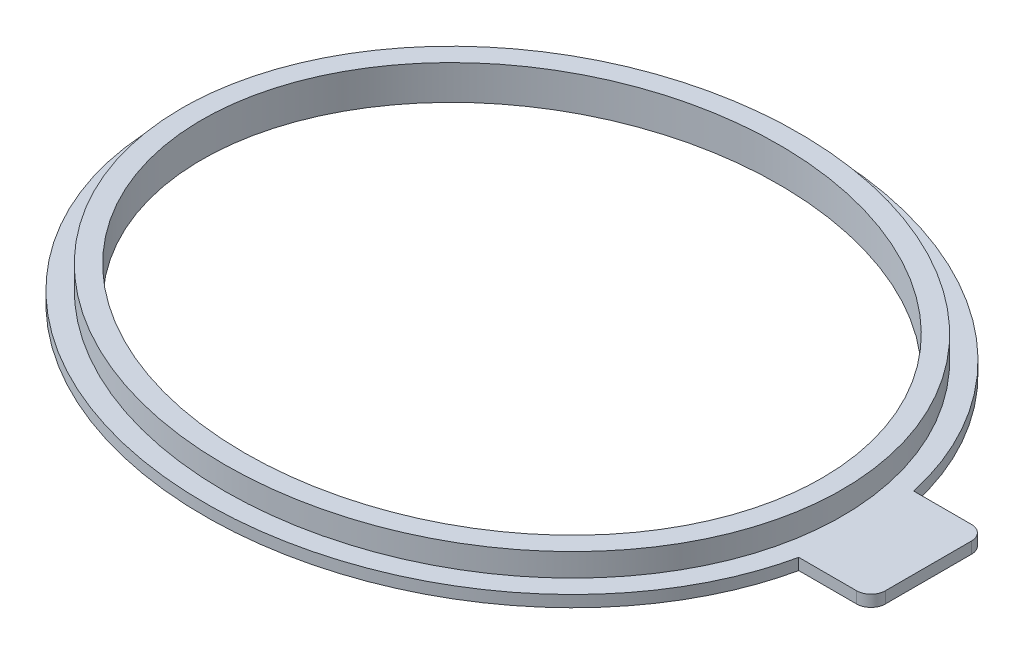
ISO-10303-21;
HEADER;
FILE_DESCRIPTION(('STEP AP214'),'2;1');
FILE_NAME('part.step','',(''),(''),'','','');
FILE_SCHEMA(('AUTOMOTIVE_DESIGN { 1 0 10303 214 1 1 1 1 }'));
ENDSEC;
DATA;
#1=APPLICATION_CONTEXT('core data for automotive mechanical design processes');
#2=APPLICATION_PROTOCOL_DEFINITION('international standard','automotive_design',2000,#1);
#3=PRODUCT_CONTEXT('',#1,'mechanical');
#4=PRODUCT('Part','Part','',(#3));
#5=PRODUCT_RELATED_PRODUCT_CATEGORY('part','',(#4));
#6=PRODUCT_DEFINITION_FORMATION('','',#4);
#7=PRODUCT_DEFINITION_CONTEXT('part definition',#1,'design');
#8=PRODUCT_DEFINITION('design','',#6,#7);
#9=PRODUCT_DEFINITION_SHAPE('','',#8);
#10=(LENGTH_UNIT() NAMED_UNIT(*) SI_UNIT(.MILLI.,.METRE.));
#11=(NAMED_UNIT(*) PLANE_ANGLE_UNIT() SI_UNIT($,.RADIAN.));
#12=(NAMED_UNIT(*) SI_UNIT($,.STERADIAN.) SOLID_ANGLE_UNIT());
#13=UNCERTAINTY_MEASURE_WITH_UNIT(LENGTH_MEASURE(1.E-05),#10,'distance_accuracy_value','');
#14=(GEOMETRIC_REPRESENTATION_CONTEXT(3) GLOBAL_UNCERTAINTY_ASSIGNED_CONTEXT((#13)) GLOBAL_UNIT_ASSIGNED_CONTEXT((#10,
#11,#12)) REPRESENTATION_CONTEXT('',''));
#15=CARTESIAN_POINT('',(0.,0.,0.));
#16=DIRECTION('',(0.,0.,1.));
#17=DIRECTION('',(1.,0.,0.));
#18=AXIS2_PLACEMENT_3D('',#15,#16,#17);
#19=CARTESIAN_POINT('',(0.,4.,0.));
#20=DIRECTION('',(0.,1.,0.));
#21=DIRECTION('',(-1.,0.,0.));
#22=AXIS2_PLACEMENT_3D('',#19,#20,#21);
#23=ELLIPSE('',#22,122.,107.);
#24=DIRECTION('',(0.,-1.,0.));
#25=VECTOR('',#24,1.);
#26=SURFACE_OF_LINEAR_EXTRUSION('',#23,#25);
#27=DIRECTION('',(0.,-1.,0.));
#28=VECTOR('',#27,1.);
#29=CARTESIAN_POINT('',(119.849862405992,4.,20.));
#30=LINE('',#29,#28);
#31=CARTESIAN_POINT('',(119.849862405992,4.,20.));
#32=VERTEX_POINT('',#31);
#33=CARTESIAN_POINT('',(119.849862405992,0.,20.));
#34=VERTEX_POINT('',#33);
#35=EDGE_CURVE('E117',#32,#34,#30,.T.);
#36=ORIENTED_EDGE('',*,*,#35,.F.);
#37=CARTESIAN_POINT('',(119.849862405992,4.,-19.9999999999999));
#38=VERTEX_POINT('',#37);
#39=EDGE_CURVE('E107',#38,#32,#23,.T.);
#40=ORIENTED_EDGE('',*,*,#39,.F.);
#41=DIRECTION('',(0.,-1.,0.));
#42=VECTOR('',#41,1.);
#43=CARTESIAN_POINT('',(119.849862405992,4.,-20.));
#44=LINE('',#43,#42);
#45=CARTESIAN_POINT('',(119.849862405992,0.,-20.));
#46=VERTEX_POINT('',#45);
#47=EDGE_CURVE('E111',#38,#46,#44,.T.);
#48=ORIENTED_EDGE('',*,*,#47,.T.);
#49=CARTESIAN_POINT('',(0.,0.,0.));
#50=DIRECTION('',(0.,1.,0.));
#51=DIRECTION('',(-1.,0.,0.));
#52=AXIS2_PLACEMENT_3D('',#49,#50,#51);
#53=ELLIPSE('',#52,122.,107.);
#54=EDGE_CURVE('E97',#46,#34,#53,.T.);
#55=ORIENTED_EDGE('',*,*,#54,.T.);
#56=EDGE_LOOP('',(#36,#40,#48,#55));
#57=FACE_BOUND('',#56,.T.);
#58=ADVANCED_FACE('F41',(#57),#26,.F.);
#59=CARTESIAN_POINT('',(0.,12.,0.));
#60=DIRECTION('',(0.,1.,0.));
#61=DIRECTION('',(0.,0.,1.));
#62=AXIS2_PLACEMENT_3D('',#59,#60,#61);
#63=PLANE('',#62);
#64=CARTESIAN_POINT('',(0.,12.,0.));
#65=DIRECTION('',(0.,1.,0.));
#66=DIRECTION('',(-1.,0.,0.));
#67=AXIS2_PLACEMENT_3D('',#64,#65,#66);
#68=ELLIPSE('',#67,115.,100.);
#69=CARTESIAN_POINT('',(-115.,12.,0.));
#70=VERTEX_POINT('',#69);
#71=EDGE_CURVE('E118',#70,#70,#68,.T.);
#72=ORIENTED_EDGE('',*,*,#71,.T.);
#73=EDGE_LOOP('',(#72));
#74=FACE_BOUND('',#73,.T.);
#75=CARTESIAN_POINT('',(0.,12.,0.));
#76=DIRECTION('',(0.,1.,0.));
#77=DIRECTION('',(1.,0.,0.));
#78=AXIS2_PLACEMENT_3D('',#75,#76,#77);
#79=ELLIPSE('',#78,108.,93.);
#80=CARTESIAN_POINT('',(108.,12.,0.));
#81=VERTEX_POINT('',#80);
#82=EDGE_CURVE('E153',#81,#81,#79,.T.);
#83=ORIENTED_EDGE('',*,*,#82,.F.);
#84=EDGE_LOOP('',(#83));
#85=FACE_BOUND('',#84,.T.);
#86=ADVANCED_FACE('F143',(#74,#85),#63,.T.);
#87=CARTESIAN_POINT('',(0.,0.,0.));
#88=DIRECTION('',(0.,1.,0.));
#89=DIRECTION('',(0.,0.,1.));
#90=AXIS2_PLACEMENT_3D('',#87,#88,#89);
#91=PLANE('',#90);
#92=DIRECTION('',(1.,0.,0.));
#93=VECTOR('',#92,1.);
#94=CARTESIAN_POINT('',(0.,0.,-20.));
#95=LINE('',#94,#93);
#96=CARTESIAN_POINT('',(140.,0.,-20.));
#97=VERTEX_POINT('',#96);
#98=EDGE_CURVE('E102',#46,#97,#95,.T.);
#99=ORIENTED_EDGE('',*,*,#98,.T.);
#100=CARTESIAN_POINT('',(140.,0.,-15.));
#101=DIRECTION('',(0.,1.,0.));
#102=DIRECTION('',(0.,0.,1.));
#103=AXIS2_PLACEMENT_3D('',#100,#101,#102);
#104=CIRCLE('',#103,5.);
#105=CARTESIAN_POINT('',(145.,0.,-15.));
#106=VERTEX_POINT('',#105);
#107=EDGE_CURVE('E192',#97,#106,#104,.F.);
#108=ORIENTED_EDGE('',*,*,#107,.T.);
#109=DIRECTION('',(0.,0.,-1.));
#110=VECTOR('',#109,1.);
#111=CARTESIAN_POINT('',(145.,0.,0.));
#112=LINE('',#111,#110);
#113=CARTESIAN_POINT('',(145.,0.,15.));
#114=VERTEX_POINT('',#113);
#115=EDGE_CURVE('E126',#114,#106,#112,.T.);
#116=ORIENTED_EDGE('',*,*,#115,.F.);
#117=CARTESIAN_POINT('',(140.,0.,15.));
#118=DIRECTION('',(0.,1.,0.));
#119=DIRECTION('',(0.,0.,1.));
#120=AXIS2_PLACEMENT_3D('',#117,#118,#119);
#121=CIRCLE('',#120,5.);
#122=CARTESIAN_POINT('',(140.,0.,20.));
#123=VERTEX_POINT('',#122);
#124=EDGE_CURVE('E195',#114,#123,#121,.F.);
#125=ORIENTED_EDGE('',*,*,#124,.T.);
#126=DIRECTION('',(1.,0.,0.));
#127=VECTOR('',#126,1.);
#128=CARTESIAN_POINT('',(0.,0.,20.));
#129=LINE('',#128,#127);
#130=EDGE_CURVE('E103',#34,#123,#129,.T.);
#131=ORIENTED_EDGE('',*,*,#130,.F.);
#132=ORIENTED_EDGE('',*,*,#54,.F.);
#133=EDGE_LOOP('',(#99,#108,#116,#125,#131,#132));
#134=FACE_BOUND('',#133,.T.);
#135=CARTESIAN_POINT('',(0.,0.,0.));
#136=DIRECTION('',(0.,1.,0.));
#137=DIRECTION('',(1.,0.,0.));
#138=AXIS2_PLACEMENT_3D('',#135,#136,#137);
#139=ELLIPSE('',#138,108.,93.);
#140=CARTESIAN_POINT('',(108.,0.,0.));
#141=VERTEX_POINT('',#140);
#142=EDGE_CURVE('E158',#141,#141,#139,.T.);
#143=ORIENTED_EDGE('',*,*,#142,.T.);
#144=EDGE_LOOP('',(#143));
#145=FACE_BOUND('',#144,.T.);
#146=ADVANCED_FACE('F99',(#134,#145),#91,.F.);
#147=DIRECTION('',(0.,-1.,0.));
#148=VECTOR('',#147,1.);
#149=SURFACE_OF_LINEAR_EXTRUSION('',#68,#148);
#150=CARTESIAN_POINT('',(0.,4.,0.));
#151=DIRECTION('',(0.,1.,0.));
#152=DIRECTION('',(-1.,0.,0.));
#153=AXIS2_PLACEMENT_3D('',#150,#151,#152);
#154=ELLIPSE('',#153,115.,100.);
#155=CARTESIAN_POINT('',(-115.,4.,0.));
#156=VERTEX_POINT('',#155);
#157=EDGE_CURVE('E137',#156,#156,#154,.T.);
#158=ORIENTED_EDGE('',*,*,#157,.T.);
#159=EDGE_LOOP('',(#158));
#160=FACE_BOUND('',#159,.T.);
#161=ORIENTED_EDGE('',*,*,#71,.F.);
#162=EDGE_LOOP('',(#161));
#163=FACE_BOUND('',#162,.T.);
#164=ADVANCED_FACE('F150',(#160,#163),#149,.F.);
#165=DIRECTION('',(0.,-1.,0.));
#166=VECTOR('',#165,1.);
#167=SURFACE_OF_LINEAR_EXTRUSION('',#79,#166);
#168=ORIENTED_EDGE('',*,*,#82,.T.);
#169=EDGE_LOOP('',(#168));
#170=FACE_BOUND('',#169,.T.);
#171=ORIENTED_EDGE('',*,*,#142,.F.);
#172=EDGE_LOOP('',(#171));
#173=FACE_BOUND('',#172,.T.);
#174=ADVANCED_FACE('F146',(#170,#173),#167,.T.);
#175=CARTESIAN_POINT('',(0.,4.,0.));
#176=DIRECTION('',(0.,1.,0.));
#177=DIRECTION('',(0.,0.,1.));
#178=AXIS2_PLACEMENT_3D('',#175,#176,#177);
#179=PLANE('',#178);
#180=ORIENTED_EDGE('',*,*,#157,.F.);
#181=EDGE_LOOP('',(#180));
#182=FACE_BOUND('',#181,.T.);
#183=DIRECTION('',(0.,0.,-1.));
#184=VECTOR('',#183,1.);
#185=CARTESIAN_POINT('',(145.,4.,0.));
#186=LINE('',#185,#184);
#187=CARTESIAN_POINT('',(145.,4.,15.));
#188=VERTEX_POINT('',#187);
#189=CARTESIAN_POINT('',(145.,4.,-15.));
#190=VERTEX_POINT('',#189);
#191=EDGE_CURVE('E130',#188,#190,#186,.T.);
#192=ORIENTED_EDGE('',*,*,#191,.T.);
#193=CARTESIAN_POINT('',(140.,4.,-15.));
#194=DIRECTION('',(0.,1.,0.));
#195=DIRECTION('',(0.,0.,1.));
#196=AXIS2_PLACEMENT_3D('',#193,#194,#195);
#197=CIRCLE('',#196,5.);
#198=CARTESIAN_POINT('',(140.,4.,-20.));
#199=VERTEX_POINT('',#198);
#200=EDGE_CURVE('E50',#190,#199,#197,.T.);
#201=ORIENTED_EDGE('',*,*,#200,.T.);
#202=DIRECTION('',(1.,0.,0.));
#203=VECTOR('',#202,1.);
#204=CARTESIAN_POINT('',(0.,4.,-20.));
#205=LINE('',#204,#203);
#206=EDGE_CURVE('E108',#38,#199,#205,.T.);
#207=ORIENTED_EDGE('',*,*,#206,.F.);
#208=ORIENTED_EDGE('',*,*,#39,.T.);
#209=DIRECTION('',(1.,0.,0.));
#210=VECTOR('',#209,1.);
#211=CARTESIAN_POINT('',(0.,4.,20.));
#212=LINE('',#211,#210);
#213=CARTESIAN_POINT('',(140.,4.,20.));
#214=VERTEX_POINT('',#213);
#215=EDGE_CURVE('E125',#32,#214,#212,.T.);
#216=ORIENTED_EDGE('',*,*,#215,.T.);
#217=CARTESIAN_POINT('',(140.,4.,15.));
#218=DIRECTION('',(0.,1.,0.));
#219=DIRECTION('',(0.,0.,1.));
#220=AXIS2_PLACEMENT_3D('',#217,#218,#219);
#221=CIRCLE('',#220,5.);
#222=EDGE_CURVE('E182',#214,#188,#221,.T.);
#223=ORIENTED_EDGE('',*,*,#222,.T.);
#224=EDGE_LOOP('',(#192,#201,#207,#208,#216,#223));
#225=FACE_BOUND('',#224,.T.);
#226=ADVANCED_FACE('F144',(#182,#225),#179,.T.);
#227=CARTESIAN_POINT('',(0.,4.,20.));
#228=DIRECTION('',(0.,0.,-1.));
#229=DIRECTION('',(-1.,0.,0.));
#230=AXIS2_PLACEMENT_3D('',#227,#228,#229);
#231=PLANE('',#230);
#232=ORIENTED_EDGE('',*,*,#130,.T.);
#233=DIRECTION('',(0.,-1.,0.));
#234=VECTOR('',#233,1.);
#235=CARTESIAN_POINT('',(140.,4.,20.));
#236=LINE('',#235,#234);
#237=EDGE_CURVE('E11',#123,#214,#236,.F.);
#238=ORIENTED_EDGE('',*,*,#237,.T.);
#239=ORIENTED_EDGE('',*,*,#215,.F.);
#240=ORIENTED_EDGE('',*,*,#35,.T.);
#241=EDGE_LOOP('',(#232,#238,#239,#240));
#242=FACE_BOUND('',#241,.T.);
#243=ADVANCED_FACE('F200',(#242),#231,.F.);
#244=CARTESIAN_POINT('',(0.,4.,-20.));
#245=DIRECTION('',(0.,0.,-1.));
#246=DIRECTION('',(-1.,0.,0.));
#247=AXIS2_PLACEMENT_3D('',#244,#245,#246);
#248=PLANE('',#247);
#249=ORIENTED_EDGE('',*,*,#206,.T.);
#250=DIRECTION('',(0.,-1.,0.));
#251=VECTOR('',#250,1.);
#252=CARTESIAN_POINT('',(140.,0.,-20.));
#253=LINE('',#252,#251);
#254=EDGE_CURVE('E123',#199,#97,#253,.T.);
#255=ORIENTED_EDGE('',*,*,#254,.T.);
#256=ORIENTED_EDGE('',*,*,#98,.F.);
#257=ORIENTED_EDGE('',*,*,#47,.F.);
#258=EDGE_LOOP('',(#249,#255,#256,#257));
#259=FACE_BOUND('',#258,.T.);
#260=ADVANCED_FACE('F121',(#259),#248,.T.);
#261=CARTESIAN_POINT('',(145.,4.,0.));
#262=DIRECTION('',(-1.,0.,0.));
#263=DIRECTION('',(0.,0.,1.));
#264=AXIS2_PLACEMENT_3D('',#261,#262,#263);
#265=PLANE('',#264);
#266=ORIENTED_EDGE('',*,*,#115,.T.);
#267=DIRECTION('',(0.,-1.,0.));
#268=VECTOR('',#267,1.);
#269=CARTESIAN_POINT('',(145.,4.,-15.));
#270=LINE('',#269,#268);
#271=EDGE_CURVE('E63',#106,#190,#270,.F.);
#272=ORIENTED_EDGE('',*,*,#271,.T.);
#273=ORIENTED_EDGE('',*,*,#191,.F.);
#274=DIRECTION('',(0.,-1.,0.));
#275=VECTOR('',#274,1.);
#276=CARTESIAN_POINT('',(145.,4.,15.));
#277=LINE('',#276,#275);
#278=EDGE_CURVE('E188',#188,#114,#277,.T.);
#279=ORIENTED_EDGE('',*,*,#278,.T.);
#280=EDGE_LOOP('',(#266,#272,#273,#279));
#281=FACE_BOUND('',#280,.T.);
#282=ADVANCED_FACE('F171',(#281),#265,.F.);
#283=CARTESIAN_POINT('',(140.,4.,-15.));
#284=DIRECTION('',(0.,1.,0.));
#285=DIRECTION('',(0.,0.,1.));
#286=AXIS2_PLACEMENT_3D('',#283,#284,#285);
#287=CYLINDRICAL_SURFACE('',#286,5.);
#288=ORIENTED_EDGE('',*,*,#200,.F.);
#289=ORIENTED_EDGE('',*,*,#271,.F.);
#290=ORIENTED_EDGE('',*,*,#107,.F.);
#291=ORIENTED_EDGE('',*,*,#254,.F.);
#292=EDGE_LOOP('',(#288,#289,#290,#291));
#293=FACE_BOUND('',#292,.T.);
#294=ADVANCED_FACE('F169',(#293),#287,.T.);
#295=CARTESIAN_POINT('',(140.,4.,15.));
#296=DIRECTION('',(0.,-1.,0.));
#297=DIRECTION('',(0.,0.,-1.));
#298=AXIS2_PLACEMENT_3D('',#295,#296,#297);
#299=CYLINDRICAL_SURFACE('',#298,5.);
#300=ORIENTED_EDGE('',*,*,#222,.F.);
#301=ORIENTED_EDGE('',*,*,#237,.F.);
#302=ORIENTED_EDGE('',*,*,#124,.F.);
#303=ORIENTED_EDGE('',*,*,#278,.F.);
#304=EDGE_LOOP('',(#300,#301,#302,#303));
#305=FACE_BOUND('',#304,.T.);
#306=ADVANCED_FACE('F43',(#305),#299,.T.);
#307=CLOSED_SHELL('',(#58,#86,#146,#164,#174,#226,#243,#260,#282,#294,#306));
#308=MANIFOLD_SOLID_BREP('B2',#307);
#309=ADVANCED_BREP_SHAPE_REPRESENTATION('',(#18,#308),#14);
#310=SHAPE_DEFINITION_REPRESENTATION(#9,#309);
ENDSEC;
END-ISO-10303-21;
